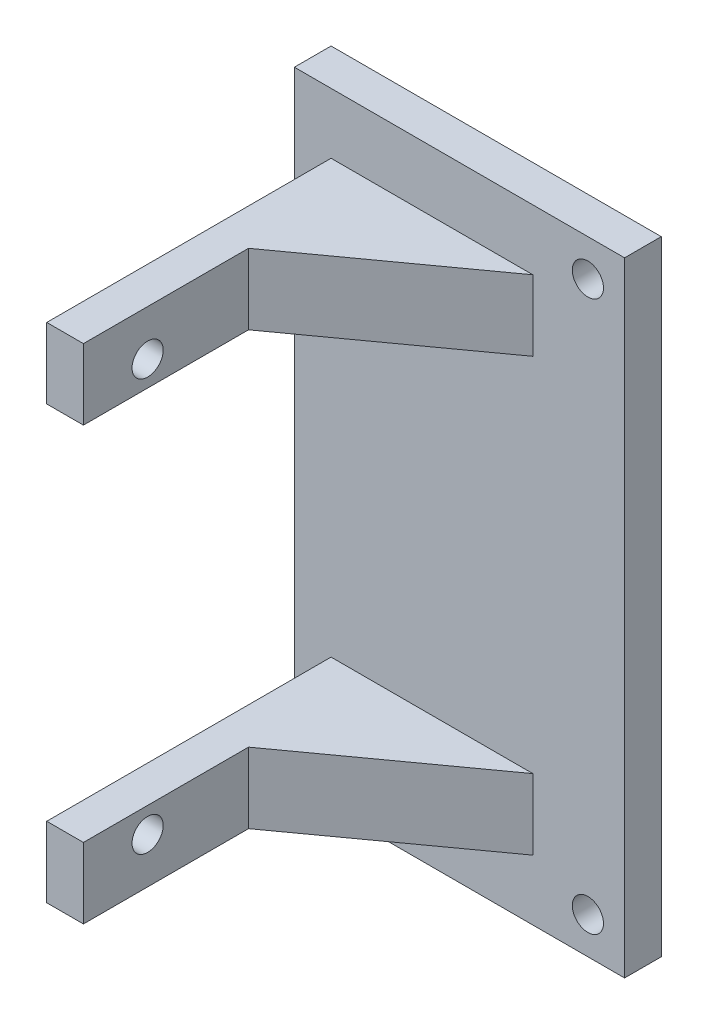
ISO-10303-21;
HEADER;
FILE_DESCRIPTION(('STEP AP214'),'2;1');
FILE_NAME('part.step','',(''),(''),'','','');
FILE_SCHEMA(('AUTOMOTIVE_DESIGN { 1 0 10303 214 1 1 1 1 }'));
ENDSEC;
DATA;
#1=APPLICATION_CONTEXT('core data for automotive mechanical design processes');
#2=APPLICATION_PROTOCOL_DEFINITION('international standard','automotive_design',2000,#1);
#3=PRODUCT_CONTEXT('',#1,'mechanical');
#4=PRODUCT('Part','Part','',(#3));
#5=PRODUCT_RELATED_PRODUCT_CATEGORY('part','',(#4));
#6=PRODUCT_DEFINITION_FORMATION('','',#4);
#7=PRODUCT_DEFINITION_CONTEXT('part definition',#1,'design');
#8=PRODUCT_DEFINITION('design','',#6,#7);
#9=PRODUCT_DEFINITION_SHAPE('','',#8);
#10=(LENGTH_UNIT() NAMED_UNIT(*) SI_UNIT(.MILLI.,.METRE.));
#11=(NAMED_UNIT(*) PLANE_ANGLE_UNIT() SI_UNIT($,.RADIAN.));
#12=(NAMED_UNIT(*) SI_UNIT($,.STERADIAN.) SOLID_ANGLE_UNIT());
#13=UNCERTAINTY_MEASURE_WITH_UNIT(LENGTH_MEASURE(1.E-05),#10,'distance_accuracy_value','');
#14=(GEOMETRIC_REPRESENTATION_CONTEXT(3) GLOBAL_UNCERTAINTY_ASSIGNED_CONTEXT((#13)) GLOBAL_UNIT_ASSIGNED_CONTEXT((#10,
#11,#12)) REPRESENTATION_CONTEXT('',''));
#15=CARTESIAN_POINT('',(0.,0.,0.));
#16=DIRECTION('',(0.,0.,1.));
#17=DIRECTION('',(1.,0.,0.));
#18=AXIS2_PLACEMENT_3D('',#15,#16,#17);
#19=CARTESIAN_POINT('',(0.,0.,61.));
#20=DIRECTION('',(0.,0.,-1.));
#21=DIRECTION('',(-1.,0.,0.));
#22=AXIS2_PLACEMENT_3D('',#19,#20,#21);
#23=PLANE('',#22);
#24=CARTESIAN_POINT('',(-52.,-30.,61.));
#25=DIRECTION('',(0.,0.,-1.));
#26=DIRECTION('',(-1.,0.,0.));
#27=AXIS2_PLACEMENT_3D('',#24,#25,#26);
#28=CIRCLE('',#27,1.7);
#29=CARTESIAN_POINT('',(-53.7,-30.,61.));
#30=VERTEX_POINT('',#29);
#31=EDGE_CURVE('E227',#30,#30,#28,.T.);
#32=ORIENTED_EDGE('',*,*,#31,.T.);
#33=EDGE_LOOP('',(#32));
#34=FACE_BOUND('',#33,.T.);
#35=CARTESIAN_POINT('',(-52.,30.,61.));
#36=DIRECTION('',(0.,0.,-1.));
#37=DIRECTION('',(-1.,0.,0.));
#38=AXIS2_PLACEMENT_3D('',#35,#36,#37);
#39=CIRCLE('',#38,1.7);
#40=CARTESIAN_POINT('',(-53.7,30.,61.));
#41=VERTEX_POINT('',#40);
#42=EDGE_CURVE('E223',#41,#41,#39,.T.);
#43=ORIENTED_EDGE('',*,*,#42,.T.);
#44=EDGE_LOOP('',(#43));
#45=FACE_BOUND('',#44,.T.);
#46=DIRECTION('',(-1.,0.,0.));
#47=VECTOR('',#46,1.);
#48=CARTESIAN_POINT('',(-80.,-19.7,61.));
#49=LINE('',#48,#47);
#50=CARTESIAN_POINT('',(-58.,-19.7,61.));
#51=VERTEX_POINT('',#50);
#52=CARTESIAN_POINT('',(-80.,-19.7,61.));
#53=VERTEX_POINT('',#52);
#54=EDGE_CURVE('E261',#51,#53,#49,.T.);
#55=ORIENTED_EDGE('',*,*,#54,.F.);
#56=DIRECTION('',(0.,-1.,0.));
#57=VECTOR('',#56,1.);
#58=CARTESIAN_POINT('',(-58.,-19.7,61.));
#59=LINE('',#58,#57);
#60=CARTESIAN_POINT('',(-58.,-27.4,61.));
#61=VERTEX_POINT('',#60);
#62=EDGE_CURVE('E250',#51,#61,#59,.T.);
#63=ORIENTED_EDGE('',*,*,#62,.T.);
#64=DIRECTION('',(1.,0.,0.));
#65=VECTOR('',#64,1.);
#66=CARTESIAN_POINT('',(-80.,-27.4,61.));
#67=LINE('',#66,#65);
#68=CARTESIAN_POINT('',(-80.,-27.4,61.));
#69=VERTEX_POINT('',#68);
#70=EDGE_CURVE('E58',#69,#61,#67,.T.);
#71=ORIENTED_EDGE('',*,*,#70,.F.);
#72=DIRECTION('',(0.,-1.,0.));
#73=VECTOR('',#72,1.);
#74=CARTESIAN_POINT('',(-80.,-27.4,61.));
#75=LINE('',#74,#73);
#76=EDGE_CURVE('E185',#53,#69,#75,.T.);
#77=ORIENTED_EDGE('',*,*,#76,.F.);
#78=EDGE_LOOP('',(#55,#63,#71,#77));
#79=FACE_BOUND('',#78,.T.);
#80=DIRECTION('',(0.,-1.,0.));
#81=VECTOR('',#80,1.);
#82=CARTESIAN_POINT('',(-84.,-34.,61.));
#83=LINE('',#82,#81);
#84=CARTESIAN_POINT('',(-84.,34.,61.));
#85=VERTEX_POINT('',#84);
#86=CARTESIAN_POINT('',(-84.,-34.,61.));
#87=VERTEX_POINT('',#86);
#88=EDGE_CURVE('E193',#85,#87,#83,.T.);
#89=ORIENTED_EDGE('',*,*,#88,.T.);
#90=DIRECTION('',(1.,0.,0.));
#91=VECTOR('',#90,1.);
#92=CARTESIAN_POINT('',(-84.,-34.,61.));
#93=LINE('',#92,#91);
#94=CARTESIAN_POINT('',(-48.,-34.,61.));
#95=VERTEX_POINT('',#94);
#96=EDGE_CURVE('E196',#87,#95,#93,.T.);
#97=ORIENTED_EDGE('',*,*,#96,.T.);
#98=DIRECTION('',(0.,1.,0.));
#99=VECTOR('',#98,1.);
#100=CARTESIAN_POINT('',(-48.,-34.,61.));
#101=LINE('',#100,#99);
#102=CARTESIAN_POINT('',(-48.,34.,61.));
#103=VERTEX_POINT('',#102);
#104=EDGE_CURVE('E199',#95,#103,#101,.T.);
#105=ORIENTED_EDGE('',*,*,#104,.T.);
#106=DIRECTION('',(-1.,0.,0.));
#107=VECTOR('',#106,1.);
#108=CARTESIAN_POINT('',(-84.,34.,61.));
#109=LINE('',#108,#107);
#110=EDGE_CURVE('E201',#103,#85,#109,.T.);
#111=ORIENTED_EDGE('',*,*,#110,.T.);
#112=EDGE_LOOP('',(#89,#97,#105,#111));
#113=FACE_BOUND('',#112,.T.);
#114=DIRECTION('',(-1.,0.,0.));
#115=VECTOR('',#114,1.);
#116=CARTESIAN_POINT('',(-80.,27.4,61.));
#117=LINE('',#116,#115);
#118=CARTESIAN_POINT('',(-58.,27.4,61.));
#119=VERTEX_POINT('',#118);
#120=CARTESIAN_POINT('',(-80.,27.4,61.));
#121=VERTEX_POINT('',#120);
#122=EDGE_CURVE('E178',#119,#121,#117,.T.);
#123=ORIENTED_EDGE('',*,*,#122,.F.);
#124=DIRECTION('',(0.,-1.,0.));
#125=VECTOR('',#124,1.);
#126=CARTESIAN_POINT('',(-58.,27.4,61.));
#127=LINE('',#126,#125);
#128=CARTESIAN_POINT('',(-58.,19.7,61.));
#129=VERTEX_POINT('',#128);
#130=EDGE_CURVE('E151',#119,#129,#127,.T.);
#131=ORIENTED_EDGE('',*,*,#130,.T.);
#132=DIRECTION('',(1.,0.,0.));
#133=VECTOR('',#132,1.);
#134=CARTESIAN_POINT('',(-80.,19.7,61.));
#135=LINE('',#134,#133);
#136=CARTESIAN_POINT('',(-80.,19.7,61.));
#137=VERTEX_POINT('',#136);
#138=EDGE_CURVE('E66',#137,#129,#135,.T.);
#139=ORIENTED_EDGE('',*,*,#138,.F.);
#140=DIRECTION('',(0.,-1.,0.));
#141=VECTOR('',#140,1.);
#142=CARTESIAN_POINT('',(-80.,19.7,61.));
#143=LINE('',#142,#141);
#144=EDGE_CURVE('E182',#121,#137,#143,.T.);
#145=ORIENTED_EDGE('',*,*,#144,.F.);
#146=EDGE_LOOP('',(#123,#131,#139,#145));
#147=FACE_BOUND('',#146,.T.);
#148=ADVANCED_FACE('F41',(#34,#45,#79,#113,#147),#23,.F.);
#149=CARTESIAN_POINT('',(-76.,19.7,92.));
#150=DIRECTION('',(-1.,0.,0.));
#151=DIRECTION('',(0.,0.,1.));
#152=AXIS2_PLACEMENT_3D('',#149,#150,#151);
#153=PLANE('',#152);
#154=CARTESIAN_POINT('',(-76.,22.44,85.));
#155=DIRECTION('',(-1.,0.,0.));
#156=DIRECTION('',(0.,0.,1.));
#157=AXIS2_PLACEMENT_3D('',#154,#155,#156);
#158=CIRCLE('',#157,1.69999999999999);
#159=CARTESIAN_POINT('',(-76.,22.44,86.7));
#160=VERTEX_POINT('',#159);
#161=EDGE_CURVE('E224',#160,#160,#158,.F.);
#162=ORIENTED_EDGE('',*,*,#161,.F.);
#163=EDGE_LOOP('',(#162));
#164=FACE_BOUND('',#163,.T.);
#165=DIRECTION('',(0.,-1.,0.));
#166=VECTOR('',#165,1.);
#167=CARTESIAN_POINT('',(-76.,27.4,74.));
#168=LINE('',#167,#166);
#169=CARTESIAN_POINT('',(-76.,27.4,74.));
#170=VERTEX_POINT('',#169);
#171=CARTESIAN_POINT('',(-76.,19.7,74.));
#172=VERTEX_POINT('',#171);
#173=EDGE_CURVE('E149',#170,#172,#168,.T.);
#174=ORIENTED_EDGE('',*,*,#173,.F.);
#175=DIRECTION('',(0.,0.,-1.));
#176=VECTOR('',#175,1.);
#177=CARTESIAN_POINT('',(-76.,27.4,92.));
#178=LINE('',#177,#176);
#179=CARTESIAN_POINT('',(-76.,27.4,92.));
#180=VERTEX_POINT('',#179);
#181=EDGE_CURVE('E161',#180,#170,#178,.T.);
#182=ORIENTED_EDGE('',*,*,#181,.F.);
#183=DIRECTION('',(0.,1.,0.));
#184=VECTOR('',#183,1.);
#185=CARTESIAN_POINT('',(-76.,19.7,92.));
#186=LINE('',#185,#184);
#187=CARTESIAN_POINT('',(-76.,19.7,92.));
#188=VERTEX_POINT('',#187);
#189=EDGE_CURVE('E187',#188,#180,#186,.T.);
#190=ORIENTED_EDGE('',*,*,#189,.F.);
#191=DIRECTION('',(0.,0.,-1.));
#192=VECTOR('',#191,1.);
#193=CARTESIAN_POINT('',(-76.,19.7,92.));
#194=LINE('',#193,#192);
#195=EDGE_CURVE('E164',#188,#172,#194,.T.);
#196=ORIENTED_EDGE('',*,*,#195,.T.);
#197=EDGE_LOOP('',(#174,#182,#190,#196));
#198=FACE_BOUND('',#197,.T.);
#199=ADVANCED_FACE('F159',(#164,#198),#153,.F.);
#200=CARTESIAN_POINT('',(-76.,-27.4,92.));
#201=DIRECTION('',(-1.,0.,0.));
#202=DIRECTION('',(0.,0.,1.));
#203=AXIS2_PLACEMENT_3D('',#200,#201,#202);
#204=PLANE('',#203);
#205=CARTESIAN_POINT('',(-76.,-22.44,85.));
#206=DIRECTION('',(-1.,0.,0.));
#207=DIRECTION('',(0.,0.,1.));
#208=AXIS2_PLACEMENT_3D('',#205,#206,#207);
#209=CIRCLE('',#208,1.69999999999999);
#210=CARTESIAN_POINT('',(-76.,-22.44,86.7));
#211=VERTEX_POINT('',#210);
#212=EDGE_CURVE('E230',#211,#211,#209,.F.);
#213=ORIENTED_EDGE('',*,*,#212,.F.);
#214=EDGE_LOOP('',(#213));
#215=FACE_BOUND('',#214,.T.);
#216=DIRECTION('',(0.,-1.,0.));
#217=VECTOR('',#216,1.);
#218=CARTESIAN_POINT('',(-76.,-19.7,74.));
#219=LINE('',#218,#217);
#220=CARTESIAN_POINT('',(-76.,-19.7,74.));
#221=VERTEX_POINT('',#220);
#222=CARTESIAN_POINT('',(-76.,-27.4,74.));
#223=VERTEX_POINT('',#222);
#224=EDGE_CURVE('E254',#221,#223,#219,.T.);
#225=ORIENTED_EDGE('',*,*,#224,.F.);
#226=DIRECTION('',(0.,0.,-1.));
#227=VECTOR('',#226,1.);
#228=CARTESIAN_POINT('',(-76.,-19.7,92.));
#229=LINE('',#228,#227);
#230=CARTESIAN_POINT('',(-76.,-19.7,92.));
#231=VERTEX_POINT('',#230);
#232=EDGE_CURVE('E275',#231,#221,#229,.T.);
#233=ORIENTED_EDGE('',*,*,#232,.F.);
#234=DIRECTION('',(0.,1.,0.));
#235=VECTOR('',#234,1.);
#236=CARTESIAN_POINT('',(-76.,-27.4,92.));
#237=LINE('',#236,#235);
#238=CARTESIAN_POINT('',(-76.,-27.4,92.));
#239=VERTEX_POINT('',#238);
#240=EDGE_CURVE('E263',#239,#231,#237,.T.);
#241=ORIENTED_EDGE('',*,*,#240,.F.);
#242=DIRECTION('',(0.,0.,-1.));
#243=VECTOR('',#242,1.);
#244=CARTESIAN_POINT('',(-76.,-27.4,92.));
#245=LINE('',#244,#243);
#246=EDGE_CURVE('E278',#239,#223,#245,.T.);
#247=ORIENTED_EDGE('',*,*,#246,.T.);
#248=EDGE_LOOP('',(#225,#233,#241,#247));
#249=FACE_BOUND('',#248,.T.);
#250=ADVANCED_FACE('F310',(#215,#249),#204,.F.);
#251=CARTESIAN_POINT('',(-84.,-34.,61.));
#252=DIRECTION('',(1.,0.,0.));
#253=DIRECTION('',(0.,0.,-1.));
#254=AXIS2_PLACEMENT_3D('',#251,#252,#253);
#255=PLANE('',#254);
#256=DIRECTION('',(0.,-1.,0.));
#257=VECTOR('',#256,1.);
#258=CARTESIAN_POINT('',(-84.,-34.,57.));
#259=LINE('',#258,#257);
#260=CARTESIAN_POINT('',(-84.,34.,57.));
#261=VERTEX_POINT('',#260);
#262=CARTESIAN_POINT('',(-84.,-34.,57.));
#263=VERTEX_POINT('',#262);
#264=EDGE_CURVE('E204',#261,#263,#259,.T.);
#265=ORIENTED_EDGE('',*,*,#264,.T.);
#266=DIRECTION('',(0.,0.,-1.));
#267=VECTOR('',#266,1.);
#268=CARTESIAN_POINT('',(-84.,-34.,61.));
#269=LINE('',#268,#267);
#270=EDGE_CURVE('E11',#87,#263,#269,.T.);
#271=ORIENTED_EDGE('',*,*,#270,.F.);
#272=ORIENTED_EDGE('',*,*,#88,.F.);
#273=DIRECTION('',(0.,0.,-1.));
#274=VECTOR('',#273,1.);
#275=CARTESIAN_POINT('',(-84.,34.,61.));
#276=LINE('',#275,#274);
#277=EDGE_CURVE('E203',#85,#261,#276,.T.);
#278=ORIENTED_EDGE('',*,*,#277,.T.);
#279=EDGE_LOOP('',(#265,#271,#272,#278));
#280=FACE_BOUND('',#279,.T.);
#281=ADVANCED_FACE('F43',(#280),#255,.F.);
#282=CARTESIAN_POINT('',(-84.,-34.,61.));
#283=DIRECTION('',(0.,1.,0.));
#284=DIRECTION('',(0.,0.,1.));
#285=AXIS2_PLACEMENT_3D('',#282,#283,#284);
#286=PLANE('',#285);
#287=DIRECTION('',(1.,0.,0.));
#288=VECTOR('',#287,1.);
#289=CARTESIAN_POINT('',(-84.,-34.,57.));
#290=LINE('',#289,#288);
#291=CARTESIAN_POINT('',(-48.,-34.,57.));
#292=VERTEX_POINT('',#291);
#293=EDGE_CURVE('E207',#263,#292,#290,.T.);
#294=ORIENTED_EDGE('',*,*,#293,.T.);
#295=DIRECTION('',(0.,0.,-1.));
#296=VECTOR('',#295,1.);
#297=CARTESIAN_POINT('',(-48.,-34.,61.));
#298=LINE('',#297,#296);
#299=EDGE_CURVE('E50',#95,#292,#298,.T.);
#300=ORIENTED_EDGE('',*,*,#299,.F.);
#301=ORIENTED_EDGE('',*,*,#96,.F.);
#302=ORIENTED_EDGE('',*,*,#270,.T.);
#303=EDGE_LOOP('',(#294,#300,#301,#302));
#304=FACE_BOUND('',#303,.T.);
#305=ADVANCED_FACE('F323',(#304),#286,.F.);
#306=CARTESIAN_POINT('',(-48.,-34.,61.));
#307=DIRECTION('',(-1.,0.,0.));
#308=DIRECTION('',(0.,0.,1.));
#309=AXIS2_PLACEMENT_3D('',#306,#307,#308);
#310=PLANE('',#309);
#311=DIRECTION('',(0.,1.,0.));
#312=VECTOR('',#311,1.);
#313=CARTESIAN_POINT('',(-48.,-34.,57.));
#314=LINE('',#313,#312);
#315=CARTESIAN_POINT('',(-48.,34.,57.));
#316=VERTEX_POINT('',#315);
#317=EDGE_CURVE('E210',#292,#316,#314,.T.);
#318=ORIENTED_EDGE('',*,*,#317,.T.);
#319=DIRECTION('',(0.,0.,-1.));
#320=VECTOR('',#319,1.);
#321=CARTESIAN_POINT('',(-48.,34.,61.));
#322=LINE('',#321,#320);
#323=EDGE_CURVE('E215',#103,#316,#322,.T.);
#324=ORIENTED_EDGE('',*,*,#323,.F.);
#325=ORIENTED_EDGE('',*,*,#104,.F.);
#326=ORIENTED_EDGE('',*,*,#299,.T.);
#327=EDGE_LOOP('',(#318,#324,#325,#326));
#328=FACE_BOUND('',#327,.T.);
#329=ADVANCED_FACE('F320',(#328),#310,.F.);
#330=CARTESIAN_POINT('',(-84.,34.,61.));
#331=DIRECTION('',(0.,-1.,0.));
#332=DIRECTION('',(0.,0.,-1.));
#333=AXIS2_PLACEMENT_3D('',#330,#331,#332);
#334=PLANE('',#333);
#335=DIRECTION('',(-1.,0.,0.));
#336=VECTOR('',#335,1.);
#337=CARTESIAN_POINT('',(-84.,34.,57.));
#338=LINE('',#337,#336);
#339=EDGE_CURVE('E197',#316,#261,#338,.T.);
#340=ORIENTED_EDGE('',*,*,#339,.T.);
#341=ORIENTED_EDGE('',*,*,#277,.F.);
#342=ORIENTED_EDGE('',*,*,#110,.F.);
#343=ORIENTED_EDGE('',*,*,#323,.T.);
#344=EDGE_LOOP('',(#340,#341,#342,#343));
#345=FACE_BOUND('',#344,.T.);
#346=ADVANCED_FACE('F317',(#345),#334,.F.);
#347=CARTESIAN_POINT('',(0.,0.,57.));
#348=DIRECTION('',(0.,0.,-1.));
#349=DIRECTION('',(-1.,0.,0.));
#350=AXIS2_PLACEMENT_3D('',#347,#348,#349);
#351=PLANE('',#350);
#352=CARTESIAN_POINT('',(-52.,-30.,57.));
#353=DIRECTION('',(0.,0.,-1.));
#354=DIRECTION('',(-1.,0.,0.));
#355=AXIS2_PLACEMENT_3D('',#352,#353,#354);
#356=CIRCLE('',#355,1.7);
#357=CARTESIAN_POINT('',(-53.7,-30.,57.));
#358=VERTEX_POINT('',#357);
#359=EDGE_CURVE('E225',#358,#358,#356,.T.);
#360=ORIENTED_EDGE('',*,*,#359,.F.);
#361=EDGE_LOOP('',(#360));
#362=FACE_BOUND('',#361,.T.);
#363=CARTESIAN_POINT('',(-52.,30.,57.));
#364=DIRECTION('',(0.,0.,-1.));
#365=DIRECTION('',(-1.,0.,0.));
#366=AXIS2_PLACEMENT_3D('',#363,#364,#365);
#367=CIRCLE('',#366,1.7);
#368=CARTESIAN_POINT('',(-53.7,30.,57.));
#369=VERTEX_POINT('',#368);
#370=EDGE_CURVE('E220',#369,#369,#367,.T.);
#371=ORIENTED_EDGE('',*,*,#370,.F.);
#372=EDGE_LOOP('',(#371));
#373=FACE_BOUND('',#372,.T.);
#374=ORIENTED_EDGE('',*,*,#264,.F.);
#375=ORIENTED_EDGE('',*,*,#339,.F.);
#376=ORIENTED_EDGE('',*,*,#317,.F.);
#377=ORIENTED_EDGE('',*,*,#293,.F.);
#378=EDGE_LOOP('',(#374,#375,#376,#377));
#379=FACE_BOUND('',#378,.T.);
#380=ADVANCED_FACE('F315',(#362,#373,#379),#351,.T.);
#381=CARTESIAN_POINT('',(-80.,19.7,92.));
#382=DIRECTION('',(1.,0.,0.));
#383=DIRECTION('',(0.,0.,-1.));
#384=AXIS2_PLACEMENT_3D('',#381,#382,#383);
#385=PLANE('',#384);
#386=CARTESIAN_POINT('',(-80.,22.44,85.));
#387=DIRECTION('',(1.,0.,0.));
#388=DIRECTION('',(0.,0.,-1.));
#389=AXIS2_PLACEMENT_3D('',#386,#387,#388);
#390=CIRCLE('',#389,1.69999999999999);
#391=CARTESIAN_POINT('',(-80.,22.44,83.3));
#392=VERTEX_POINT('',#391);
#393=EDGE_CURVE('E45',#392,#392,#390,.F.);
#394=ORIENTED_EDGE('',*,*,#393,.F.);
#395=EDGE_LOOP('',(#394));
#396=FACE_BOUND('',#395,.T.);
#397=ORIENTED_EDGE('',*,*,#144,.T.);
#398=DIRECTION('',(0.,0.,-1.));
#399=VECTOR('',#398,1.);
#400=CARTESIAN_POINT('',(-80.,19.7,92.));
#401=LINE('',#400,#399);
#402=CARTESIAN_POINT('',(-80.,19.7,92.));
#403=VERTEX_POINT('',#402);
#404=EDGE_CURVE('E174',#403,#137,#401,.T.);
#405=ORIENTED_EDGE('',*,*,#404,.F.);
#406=DIRECTION('',(0.,-1.,0.));
#407=VECTOR('',#406,1.);
#408=CARTESIAN_POINT('',(-80.,19.7,92.));
#409=LINE('',#408,#407);
#410=CARTESIAN_POINT('',(-80.,27.4,92.));
#411=VERTEX_POINT('',#410);
#412=EDGE_CURVE('E180',#411,#403,#409,.T.);
#413=ORIENTED_EDGE('',*,*,#412,.F.);
#414=DIRECTION('',(0.,0.,-1.));
#415=VECTOR('',#414,1.);
#416=CARTESIAN_POINT('',(-80.,27.4,92.));
#417=LINE('',#416,#415);
#418=EDGE_CURVE('E170',#411,#121,#417,.T.);
#419=ORIENTED_EDGE('',*,*,#418,.T.);
#420=EDGE_LOOP('',(#397,#405,#413,#419));
#421=FACE_BOUND('',#420,.T.);
#422=ADVANCED_FACE('F286',(#396,#421),#385,.F.);
#423=CARTESIAN_POINT('',(-80.,19.7,92.));
#424=DIRECTION('',(0.,1.,0.));
#425=DIRECTION('',(0.,0.,1.));
#426=AXIS2_PLACEMENT_3D('',#423,#424,#425);
#427=PLANE('',#426);
#428=ORIENTED_EDGE('',*,*,#138,.T.);
#429=DIRECTION('',(0.810679228399881,0.,-0.585490553844358));
#430=VECTOR('',#429,1.);
#431=CARTESIAN_POINT('',(-58.,19.7,61.));
#432=LINE('',#431,#430);
#433=EDGE_CURVE('E155',#172,#129,#432,.T.);
#434=ORIENTED_EDGE('',*,*,#433,.F.);
#435=ORIENTED_EDGE('',*,*,#195,.F.);
#436=DIRECTION('',(1.,0.,0.));
#437=VECTOR('',#436,1.);
#438=CARTESIAN_POINT('',(-80.,19.7,92.));
#439=LINE('',#438,#437);
#440=EDGE_CURVE('E189',#403,#188,#439,.T.);
#441=ORIENTED_EDGE('',*,*,#440,.F.);
#442=ORIENTED_EDGE('',*,*,#404,.T.);
#443=EDGE_LOOP('',(#428,#434,#435,#441,#442));
#444=FACE_BOUND('',#443,.T.);
#445=ADVANCED_FACE('F283',(#444),#427,.F.);
#446=CARTESIAN_POINT('',(-80.,27.4,92.));
#447=DIRECTION('',(0.,-1.,0.));
#448=DIRECTION('',(0.,0.,-1.));
#449=AXIS2_PLACEMENT_3D('',#446,#447,#448);
#450=PLANE('',#449);
#451=ORIENTED_EDGE('',*,*,#122,.T.);
#452=ORIENTED_EDGE('',*,*,#418,.F.);
#453=DIRECTION('',(-1.,0.,0.));
#454=VECTOR('',#453,1.);
#455=CARTESIAN_POINT('',(-80.,27.4,92.));
#456=LINE('',#455,#454);
#457=EDGE_CURVE('E169',#180,#411,#456,.T.);
#458=ORIENTED_EDGE('',*,*,#457,.F.);
#459=ORIENTED_EDGE('',*,*,#181,.T.);
#460=DIRECTION('',(0.810679228399881,0.,-0.585490553844358));
#461=VECTOR('',#460,1.);
#462=CARTESIAN_POINT('',(-58.,27.4,61.));
#463=LINE('',#462,#461);
#464=EDGE_CURVE('E145',#170,#119,#463,.T.);
#465=ORIENTED_EDGE('',*,*,#464,.T.);
#466=EDGE_LOOP('',(#451,#452,#458,#459,#465));
#467=FACE_BOUND('',#466,.T.);
#468=ADVANCED_FACE('F167',(#467),#450,.F.);
#469=CARTESIAN_POINT('',(0.,0.,92.));
#470=DIRECTION('',(0.,0.,-1.));
#471=DIRECTION('',(-1.,0.,0.));
#472=AXIS2_PLACEMENT_3D('',#469,#470,#471);
#473=PLANE('',#472);
#474=ORIENTED_EDGE('',*,*,#412,.T.);
#475=ORIENTED_EDGE('',*,*,#440,.T.);
#476=ORIENTED_EDGE('',*,*,#189,.T.);
#477=ORIENTED_EDGE('',*,*,#457,.T.);
#478=EDGE_LOOP('',(#474,#475,#476,#477));
#479=FACE_BOUND('',#478,.T.);
#480=ADVANCED_FACE('F288',(#479),#473,.F.);
#481=CARTESIAN_POINT('',(-80.,-27.4,92.));
#482=DIRECTION('',(1.,0.,0.));
#483=DIRECTION('',(0.,0.,-1.));
#484=AXIS2_PLACEMENT_3D('',#481,#482,#483);
#485=PLANE('',#484);
#486=CARTESIAN_POINT('',(-80.,-22.44,85.));
#487=DIRECTION('',(1.,0.,0.));
#488=DIRECTION('',(0.,0.,-1.));
#489=AXIS2_PLACEMENT_3D('',#486,#487,#488);
#490=CIRCLE('',#489,1.69999999999999);
#491=CARTESIAN_POINT('',(-80.,-22.44,83.3));
#492=VERTEX_POINT('',#491);
#493=EDGE_CURVE('E228',#492,#492,#490,.F.);
#494=ORIENTED_EDGE('',*,*,#493,.F.);
#495=EDGE_LOOP('',(#494));
#496=FACE_BOUND('',#495,.T.);
#497=ORIENTED_EDGE('',*,*,#76,.T.);
#498=DIRECTION('',(0.,0.,-1.));
#499=VECTOR('',#498,1.);
#500=CARTESIAN_POINT('',(-80.,-27.4,92.));
#501=LINE('',#500,#499);
#502=CARTESIAN_POINT('',(-80.,-27.4,92.));
#503=VERTEX_POINT('',#502);
#504=EDGE_CURVE('E208',#503,#69,#501,.T.);
#505=ORIENTED_EDGE('',*,*,#504,.F.);
#506=DIRECTION('',(0.,-1.,0.));
#507=VECTOR('',#506,1.);
#508=CARTESIAN_POINT('',(-80.,-27.4,92.));
#509=LINE('',#508,#507);
#510=CARTESIAN_POINT('',(-80.,-19.7,92.));
#511=VERTEX_POINT('',#510);
#512=EDGE_CURVE('E257',#511,#503,#509,.T.);
#513=ORIENTED_EDGE('',*,*,#512,.F.);
#514=DIRECTION('',(0.,0.,-1.));
#515=VECTOR('',#514,1.);
#516=CARTESIAN_POINT('',(-80.,-19.7,92.));
#517=LINE('',#516,#515);
#518=EDGE_CURVE('E267',#511,#53,#517,.T.);
#519=ORIENTED_EDGE('',*,*,#518,.T.);
#520=EDGE_LOOP('',(#497,#505,#513,#519));
#521=FACE_BOUND('',#520,.T.);
#522=ADVANCED_FACE('F290',(#496,#521),#485,.F.);
#523=CARTESIAN_POINT('',(-80.,-27.4,92.));
#524=DIRECTION('',(0.,1.,0.));
#525=DIRECTION('',(0.,0.,1.));
#526=AXIS2_PLACEMENT_3D('',#523,#524,#525);
#527=PLANE('',#526);
#528=ORIENTED_EDGE('',*,*,#70,.T.);
#529=DIRECTION('',(0.810679228399881,0.,-0.585490553844358));
#530=VECTOR('',#529,1.);
#531=CARTESIAN_POINT('',(-58.,-27.4,61.));
#532=LINE('',#531,#530);
#533=EDGE_CURVE('E165',#223,#61,#532,.T.);
#534=ORIENTED_EDGE('',*,*,#533,.F.);
#535=ORIENTED_EDGE('',*,*,#246,.F.);
#536=DIRECTION('',(1.,0.,0.));
#537=VECTOR('',#536,1.);
#538=CARTESIAN_POINT('',(-80.,-27.4,92.));
#539=LINE('',#538,#537);
#540=EDGE_CURVE('E260',#503,#239,#539,.T.);
#541=ORIENTED_EDGE('',*,*,#540,.F.);
#542=ORIENTED_EDGE('',*,*,#504,.T.);
#543=EDGE_LOOP('',(#528,#534,#535,#541,#542));
#544=FACE_BOUND('',#543,.T.);
#545=ADVANCED_FACE('F297',(#544),#527,.F.);
#546=CARTESIAN_POINT('',(-80.,-19.7,92.));
#547=DIRECTION('',(0.,-1.,0.));
#548=DIRECTION('',(0.,0.,-1.));
#549=AXIS2_PLACEMENT_3D('',#546,#547,#548);
#550=PLANE('',#549);
#551=ORIENTED_EDGE('',*,*,#54,.T.);
#552=ORIENTED_EDGE('',*,*,#518,.F.);
#553=DIRECTION('',(-1.,0.,0.));
#554=VECTOR('',#553,1.);
#555=CARTESIAN_POINT('',(-80.,-19.7,92.));
#556=LINE('',#555,#554);
#557=EDGE_CURVE('E265',#231,#511,#556,.T.);
#558=ORIENTED_EDGE('',*,*,#557,.F.);
#559=ORIENTED_EDGE('',*,*,#232,.T.);
#560=DIRECTION('',(0.810679228399881,0.,-0.585490553844358));
#561=VECTOR('',#560,1.);
#562=CARTESIAN_POINT('',(-58.,-19.7,61.));
#563=LINE('',#562,#561);
#564=EDGE_CURVE('E247',#221,#51,#563,.T.);
#565=ORIENTED_EDGE('',*,*,#564,.T.);
#566=EDGE_LOOP('',(#551,#552,#558,#559,#565));
#567=FACE_BOUND('',#566,.T.);
#568=ADVANCED_FACE('F354',(#567),#550,.F.);
#569=CARTESIAN_POINT('',(0.,0.,92.));
#570=DIRECTION('',(0.,0.,-1.));
#571=DIRECTION('',(-1.,0.,0.));
#572=AXIS2_PLACEMENT_3D('',#569,#570,#571);
#573=PLANE('',#572);
#574=ORIENTED_EDGE('',*,*,#512,.T.);
#575=ORIENTED_EDGE('',*,*,#540,.T.);
#576=ORIENTED_EDGE('',*,*,#240,.T.);
#577=ORIENTED_EDGE('',*,*,#557,.T.);
#578=EDGE_LOOP('',(#574,#575,#576,#577));
#579=FACE_BOUND('',#578,.T.);
#580=ADVANCED_FACE('F426',(#579),#573,.F.);
#581=CARTESIAN_POINT('',(-58.,-19.7,61.));
#582=DIRECTION('',(-0.585490553844358,0.,-0.810679228399881));
#583=DIRECTION('',(-0.810679228399881,0.,0.585490553844359));
#584=AXIS2_PLACEMENT_3D('',#581,#582,#583);
#585=PLANE('',#584);
#586=ORIENTED_EDGE('',*,*,#533,.T.);
#587=ORIENTED_EDGE('',*,*,#62,.F.);
#588=ORIENTED_EDGE('',*,*,#564,.F.);
#589=ORIENTED_EDGE('',*,*,#224,.T.);
#590=EDGE_LOOP('',(#586,#587,#588,#589));
#591=FACE_BOUND('',#590,.T.);
#592=ADVANCED_FACE('F369',(#591),#585,.F.);
#593=CARTESIAN_POINT('',(-58.,27.4,61.));
#594=DIRECTION('',(-0.585490553844358,0.,-0.810679228399881));
#595=DIRECTION('',(-0.810679228399881,0.,0.585490553844359));
#596=AXIS2_PLACEMENT_3D('',#593,#594,#595);
#597=PLANE('',#596);
#598=ORIENTED_EDGE('',*,*,#433,.T.);
#599=ORIENTED_EDGE('',*,*,#130,.F.);
#600=ORIENTED_EDGE('',*,*,#464,.F.);
#601=ORIENTED_EDGE('',*,*,#173,.T.);
#602=EDGE_LOOP('',(#598,#599,#600,#601));
#603=FACE_BOUND('',#602,.T.);
#604=ADVANCED_FACE('F148',(#603),#597,.F.);
#605=CARTESIAN_POINT('',(-52.,30.,56.));
#606=DIRECTION('',(0.,0.,1.));
#607=DIRECTION('',(1.,0.,0.));
#608=AXIS2_PLACEMENT_3D('',#605,#606,#607);
#609=CYLINDRICAL_SURFACE('',#608,1.7);
#610=ORIENTED_EDGE('',*,*,#370,.T.);
#611=EDGE_LOOP('',(#610));
#612=FACE_BOUND('',#611,.T.);
#613=ORIENTED_EDGE('',*,*,#42,.F.);
#614=EDGE_LOOP('',(#613));
#615=FACE_BOUND('',#614,.T.);
#616=ADVANCED_FACE('F379',(#612,#615),#609,.F.);
#617=CARTESIAN_POINT('',(-52.,-30.,56.));
#618=DIRECTION('',(0.,0.,1.));
#619=DIRECTION('',(1.,0.,0.));
#620=AXIS2_PLACEMENT_3D('',#617,#618,#619);
#621=CYLINDRICAL_SURFACE('',#620,1.7);
#622=ORIENTED_EDGE('',*,*,#359,.T.);
#623=EDGE_LOOP('',(#622));
#624=FACE_BOUND('',#623,.T.);
#625=ORIENTED_EDGE('',*,*,#31,.F.);
#626=EDGE_LOOP('',(#625));
#627=FACE_BOUND('',#626,.T.);
#628=ADVANCED_FACE('F392',(#624,#627),#621,.F.);
#629=CARTESIAN_POINT('',(120.,-22.44,85.));
#630=DIRECTION('',(-1.,0.,0.));
#631=DIRECTION('',(0.,0.,1.));
#632=AXIS2_PLACEMENT_3D('',#629,#630,#631);
#633=CYLINDRICAL_SURFACE('',#632,1.69999999999999);
#634=ORIENTED_EDGE('',*,*,#493,.T.);
#635=EDGE_LOOP('',(#634));
#636=FACE_BOUND('',#635,.T.);
#637=ORIENTED_EDGE('',*,*,#212,.T.);
#638=EDGE_LOOP('',(#637));
#639=FACE_BOUND('',#638,.T.);
#640=ADVANCED_FACE('F402',(#636,#639),#633,.F.);
#641=CARTESIAN_POINT('',(120.,22.44,85.));
#642=DIRECTION('',(-1.,0.,0.));
#643=DIRECTION('',(0.,0.,1.));
#644=AXIS2_PLACEMENT_3D('',#641,#642,#643);
#645=CYLINDRICAL_SURFACE('',#644,1.69999999999999);
#646=ORIENTED_EDGE('',*,*,#393,.T.);
#647=EDGE_LOOP('',(#646));
#648=FACE_BOUND('',#647,.T.);
#649=ORIENTED_EDGE('',*,*,#161,.T.);
#650=EDGE_LOOP('',(#649));
#651=FACE_BOUND('',#650,.T.);
#652=ADVANCED_FACE('F412',(#648,#651),#645,.F.);
#653=CLOSED_SHELL('',(#148,#199,#250,#281,#305,#329,#346,#380,#422,#445,#468,#480,#522,#545,
#568,#580,#592,#604,#616,#628,#640,#652));
#654=MANIFOLD_SOLID_BREP('B2',#653);
#655=ADVANCED_BREP_SHAPE_REPRESENTATION('',(#18,#654),#14);
#656=SHAPE_DEFINITION_REPRESENTATION(#9,#655);
ENDSEC;
END-ISO-10303-21;
